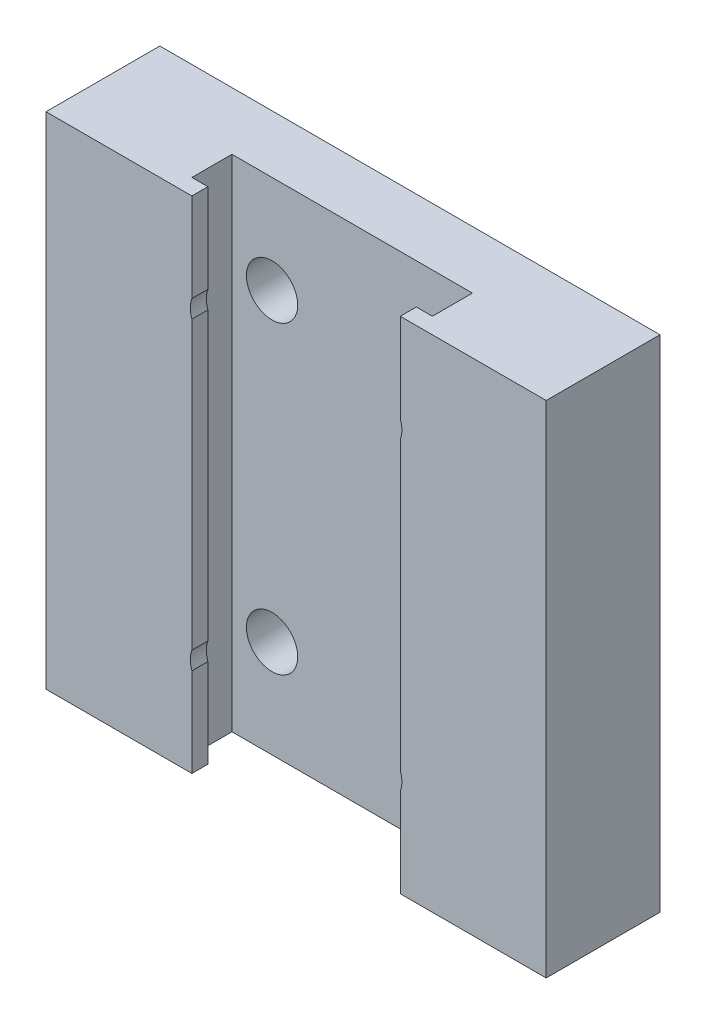
ISO-10303-21;
HEADER;
FILE_DESCRIPTION(('STEP AP214'),'2;1');
FILE_NAME('part.step','',(''),(''),'','','');
FILE_SCHEMA(('AUTOMOTIVE_DESIGN { 1 0 10303 214 1 1 1 1 }'));
ENDSEC;
DATA;
#1=APPLICATION_CONTEXT('core data for automotive mechanical design processes');
#2=APPLICATION_PROTOCOL_DEFINITION('international standard','automotive_design',2000,#1);
#3=PRODUCT_CONTEXT('',#1,'mechanical');
#4=PRODUCT('Part','Part','',(#3));
#5=PRODUCT_RELATED_PRODUCT_CATEGORY('part','',(#4));
#6=PRODUCT_DEFINITION_FORMATION('','',#4);
#7=PRODUCT_DEFINITION_CONTEXT('part definition',#1,'design');
#8=PRODUCT_DEFINITION('design','',#6,#7);
#9=PRODUCT_DEFINITION_SHAPE('','',#8);
#10=(LENGTH_UNIT() NAMED_UNIT(*) SI_UNIT(.MILLI.,.METRE.));
#11=(NAMED_UNIT(*) PLANE_ANGLE_UNIT() SI_UNIT($,.RADIAN.));
#12=(NAMED_UNIT(*) SI_UNIT($,.STERADIAN.) SOLID_ANGLE_UNIT());
#13=UNCERTAINTY_MEASURE_WITH_UNIT(LENGTH_MEASURE(1.E-05),#10,'distance_accuracy_value','');
#14=(GEOMETRIC_REPRESENTATION_CONTEXT(3) GLOBAL_UNCERTAINTY_ASSIGNED_CONTEXT((#13)) GLOBAL_UNIT_ASSIGNED_CONTEXT((#10,
#11,#12)) REPRESENTATION_CONTEXT('',''));
#15=CARTESIAN_POINT('',(0.,0.,0.));
#16=DIRECTION('',(0.,0.,1.));
#17=DIRECTION('',(1.,0.,0.));
#18=AXIS2_PLACEMENT_3D('',#15,#16,#17);
#19=CARTESIAN_POINT('',(6.5,31.2,0.275116875338784));
#20=DIRECTION('',(1.,0.,0.));
#21=DIRECTION('',(0.,0.,-1.));
#22=AXIS2_PLACEMENT_3D('',#19,#20,#21);
#23=PLANE('',#22);
#24=DIRECTION('',(0.,-1.,0.));
#25=VECTOR('',#24,1.);
#26=CARTESIAN_POINT('',(6.5,31.2,1.27511687533878));
#27=LINE('',#26,#25);
#28=CARTESIAN_POINT('',(6.5,5.543223563717,1.27511687533878));
#29=VERTEX_POINT('',#28);
#30=CARTESIAN_POINT('',(6.5,0.,1.27511687533878));
#31=VERTEX_POINT('',#30);
#32=EDGE_CURVE('E360',#29,#31,#27,.T.);
#33=ORIENTED_EDGE('',*,*,#32,.F.);
#34=DIRECTION('',(0.,0.,-1.));
#35=VECTOR('',#34,1.);
#36=CARTESIAN_POINT('',(6.5,5.543223563717,4.17511687533879));
#37=LINE('',#36,#35);
#38=CARTESIAN_POINT('',(6.5,5.543223563717,0.275116875338784));
#39=VERTEX_POINT('',#38);
#40=EDGE_CURVE('E50',#29,#39,#37,.T.);
#41=ORIENTED_EDGE('',*,*,#40,.T.);
#42=DIRECTION('',(0.,-1.,0.));
#43=VECTOR('',#42,1.);
#44=CARTESIAN_POINT('',(6.5,31.2,0.275116875338784));
#45=LINE('',#44,#43);
#46=CARTESIAN_POINT('',(6.5,0.,0.275116875338784));
#47=VERTEX_POINT('',#46);
#48=EDGE_CURVE('E364',#39,#47,#45,.T.);
#49=ORIENTED_EDGE('',*,*,#48,.T.);
#50=DIRECTION('',(0.,0.,1.));
#51=VECTOR('',#50,1.);
#52=CARTESIAN_POINT('',(6.5,0.,0.275116875338784));
#53=LINE('',#52,#51);
#54=EDGE_CURVE('E230',#47,#31,#53,.T.);
#55=ORIENTED_EDGE('',*,*,#54,.T.);
#56=EDGE_LOOP('',(#33,#41,#49,#55));
#57=FACE_BOUND('',#56,.T.);
#58=ADVANCED_FACE('F35',(#57),#23,.F.);
#59=CARTESIAN_POINT('',(6.5,24.543223563717,0.275116875338784));
#60=VERTEX_POINT('',#59);
#61=CARTESIAN_POINT('',(6.5,6.656776436283,0.275116875338784));
#62=VERTEX_POINT('',#61);
#63=EDGE_CURVE('E370',#60,#62,#45,.T.);
#64=ORIENTED_EDGE('',*,*,#63,.T.);
#65=DIRECTION('',(0.,0.,-1.));
#66=VECTOR('',#65,1.);
#67=CARTESIAN_POINT('',(6.5,6.656776436283,4.17511687533879));
#68=LINE('',#67,#66);
#69=CARTESIAN_POINT('',(6.5,6.656776436283,1.27511687533878));
#70=VERTEX_POINT('',#69);
#71=EDGE_CURVE('E270',#62,#70,#68,.F.);
#72=ORIENTED_EDGE('',*,*,#71,.T.);
#73=CARTESIAN_POINT('',(6.5,24.543223563717,1.27511687533878));
#74=VERTEX_POINT('',#73);
#75=EDGE_CURVE('E365',#74,#70,#27,.T.);
#76=ORIENTED_EDGE('',*,*,#75,.F.);
#77=DIRECTION('',(0.,0.,-1.));
#78=VECTOR('',#77,1.);
#79=CARTESIAN_POINT('',(6.5,24.543223563717,4.17511687533879));
#80=LINE('',#79,#78);
#81=EDGE_CURVE('E58',#74,#60,#80,.T.);
#82=ORIENTED_EDGE('',*,*,#81,.T.);
#83=EDGE_LOOP('',(#64,#72,#76,#82));
#84=FACE_BOUND('',#83,.T.);
#85=ADVANCED_FACE('F422',(#84),#23,.F.);
#86=CARTESIAN_POINT('',(-6.5,31.2,0.275116875338785));
#87=DIRECTION('',(-1.,0.,0.));
#88=DIRECTION('',(0.,0.,1.));
#89=AXIS2_PLACEMENT_3D('',#86,#87,#88);
#90=PLANE('',#89);
#91=DIRECTION('',(0.,-1.,0.));
#92=VECTOR('',#91,1.);
#93=CARTESIAN_POINT('',(-6.5,31.2,1.27511687533879));
#94=LINE('',#93,#92);
#95=CARTESIAN_POINT('',(-6.5,24.543223563717,1.27511687533879));
#96=VERTEX_POINT('',#95);
#97=CARTESIAN_POINT('',(-6.5,6.65677643628301,1.27511687533879));
#98=VERTEX_POINT('',#97);
#99=EDGE_CURVE('E200',#96,#98,#94,.T.);
#100=ORIENTED_EDGE('',*,*,#99,.T.);
#101=DIRECTION('',(0.,0.,-1.));
#102=VECTOR('',#101,1.);
#103=CARTESIAN_POINT('',(-6.5,6.65677643628301,4.17511687533879));
#104=LINE('',#103,#102);
#105=CARTESIAN_POINT('',(-6.5,6.65677643628301,0.275116875338785));
#106=VERTEX_POINT('',#105);
#107=EDGE_CURVE('E293',#98,#106,#104,.T.);
#108=ORIENTED_EDGE('',*,*,#107,.T.);
#109=DIRECTION('',(0.,-1.,0.));
#110=VECTOR('',#109,1.);
#111=CARTESIAN_POINT('',(-6.5,31.2,0.275116875338785));
#112=LINE('',#111,#110);
#113=CARTESIAN_POINT('',(-6.5,24.543223563717,0.275116875338785));
#114=VERTEX_POINT('',#113);
#115=EDGE_CURVE('E197',#114,#106,#112,.T.);
#116=ORIENTED_EDGE('',*,*,#115,.F.);
#117=DIRECTION('',(0.,0.,-1.));
#118=VECTOR('',#117,1.);
#119=CARTESIAN_POINT('',(-6.5,24.543223563717,4.17511687533879));
#120=LINE('',#119,#118);
#121=EDGE_CURVE('E176',#114,#96,#120,.F.);
#122=ORIENTED_EDGE('',*,*,#121,.T.);
#123=EDGE_LOOP('',(#100,#108,#116,#122));
#124=FACE_BOUND('',#123,.T.);
#125=ADVANCED_FACE('F400',(#124),#90,.F.);
#126=CARTESIAN_POINT('',(-6.5,31.2,1.27511687533879));
#127=VERTEX_POINT('',#126);
#128=CARTESIAN_POINT('',(-6.5,25.656776436283,1.27511687533879));
#129=VERTEX_POINT('',#128);
#130=EDGE_CURVE('E190',#127,#129,#94,.T.);
#131=ORIENTED_EDGE('',*,*,#130,.T.);
#132=DIRECTION('',(0.,0.,-1.));
#133=VECTOR('',#132,1.);
#134=CARTESIAN_POINT('',(-6.5,25.656776436283,4.17511687533879));
#135=LINE('',#134,#133);
#136=CARTESIAN_POINT('',(-6.5,25.656776436283,0.275116875338785));
#137=VERTEX_POINT('',#136);
#138=EDGE_CURVE('E173',#129,#137,#135,.T.);
#139=ORIENTED_EDGE('',*,*,#138,.T.);
#140=CARTESIAN_POINT('',(-6.5,31.2,0.275116875338785));
#141=VERTEX_POINT('',#140);
#142=EDGE_CURVE('E187',#141,#137,#112,.T.);
#143=ORIENTED_EDGE('',*,*,#142,.F.);
#144=DIRECTION('',(0.,0.,-1.));
#145=VECTOR('',#144,1.);
#146=CARTESIAN_POINT('',(-6.5,31.2,0.275116875338785));
#147=LINE('',#146,#145);
#148=EDGE_CURVE('E211',#127,#141,#147,.T.);
#149=ORIENTED_EDGE('',*,*,#148,.F.);
#150=EDGE_LOOP('',(#131,#139,#143,#149));
#151=FACE_BOUND('',#150,.T.);
#152=ADVANCED_FACE('F185',(#151),#90,.F.);
#153=CARTESIAN_POINT('',(-7.5,31.2,-2.22488312466121));
#154=DIRECTION('',(-1.,0.,0.));
#155=DIRECTION('',(0.,0.,1.));
#156=AXIS2_PLACEMENT_3D('',#153,#154,#155);
#157=PLANE('',#156);
#158=DIRECTION('',(0.,0.,-1.));
#159=VECTOR('',#158,1.);
#160=CARTESIAN_POINT('',(-7.5,0.,-2.22488312466121));
#161=LINE('',#160,#159);
#162=CARTESIAN_POINT('',(-7.5,0.,0.275116875338785));
#163=VERTEX_POINT('',#162);
#164=CARTESIAN_POINT('',(-7.5,0.,-2.22488312466121));
#165=VERTEX_POINT('',#164);
#166=EDGE_CURVE('E240',#163,#165,#161,.T.);
#167=ORIENTED_EDGE('',*,*,#166,.T.);
#168=DIRECTION('',(0.,-1.,0.));
#169=VECTOR('',#168,1.);
#170=CARTESIAN_POINT('',(-7.5,31.2,-2.22488312466121));
#171=LINE('',#170,#169);
#172=CARTESIAN_POINT('',(-7.5,31.2,-2.22488312466121));
#173=VERTEX_POINT('',#172);
#174=EDGE_CURVE('E181',#173,#165,#171,.T.);
#175=ORIENTED_EDGE('',*,*,#174,.F.);
#176=DIRECTION('',(0.,0.,-1.));
#177=VECTOR('',#176,1.);
#178=CARTESIAN_POINT('',(-7.5,31.2,-2.22488312466121));
#179=LINE('',#178,#177);
#180=CARTESIAN_POINT('',(-7.5,31.2,0.275116875338785));
#181=VERTEX_POINT('',#180);
#182=EDGE_CURVE('E216',#181,#173,#179,.T.);
#183=ORIENTED_EDGE('',*,*,#182,.F.);
#184=DIRECTION('',(0.,-1.,0.));
#185=VECTOR('',#184,1.);
#186=CARTESIAN_POINT('',(-7.5,31.2,0.275116875338785));
#187=LINE('',#186,#185);
#188=EDGE_CURVE('E203',#181,#163,#187,.T.);
#189=ORIENTED_EDGE('',*,*,#188,.T.);
#190=EDGE_LOOP('',(#167,#175,#183,#189));
#191=FACE_BOUND('',#190,.T.);
#192=ADVANCED_FACE('F37',(#191),#157,.F.);
#193=CARTESIAN_POINT('',(7.5,31.2,-2.22488312466122));
#194=DIRECTION('',(0.,0.,-1.));
#195=DIRECTION('',(-1.,0.,0.));
#196=AXIS2_PLACEMENT_3D('',#193,#194,#195);
#197=PLANE('',#196);
#198=CARTESIAN_POINT('',(5.,6.1,-2.22488312466122));
#199=DIRECTION('',(0.,0.,-1.));
#200=DIRECTION('',(-1.,0.,0.));
#201=AXIS2_PLACEMENT_3D('',#198,#199,#200);
#202=CIRCLE('',#201,1.6);
#203=CARTESIAN_POINT('',(3.4,6.1,-2.22488312466122));
#204=VERTEX_POINT('',#203);
#205=EDGE_CURVE('E241',#204,#204,#202,.T.);
#206=ORIENTED_EDGE('',*,*,#205,.T.);
#207=EDGE_LOOP('',(#206));
#208=FACE_BOUND('',#207,.T.);
#209=CARTESIAN_POINT('',(-5.,6.1,-2.22488312466121));
#210=DIRECTION('',(0.,0.,-1.));
#211=DIRECTION('',(-1.,0.,0.));
#212=AXIS2_PLACEMENT_3D('',#209,#210,#211);
#213=CIRCLE('',#212,1.6);
#214=CARTESIAN_POINT('',(-6.6,6.1,-2.22488312466121));
#215=VERTEX_POINT('',#214);
#216=EDGE_CURVE('E287',#215,#215,#213,.T.);
#217=ORIENTED_EDGE('',*,*,#216,.T.);
#218=EDGE_LOOP('',(#217));
#219=FACE_BOUND('',#218,.T.);
#220=CARTESIAN_POINT('',(-5.,25.1,-2.22488312466121));
#221=DIRECTION('',(0.,0.,-1.));
#222=DIRECTION('',(-1.,0.,0.));
#223=AXIS2_PLACEMENT_3D('',#220,#221,#222);
#224=CIRCLE('',#223,1.6);
#225=CARTESIAN_POINT('',(-6.6,25.1,-2.22488312466121));
#226=VERTEX_POINT('',#225);
#227=EDGE_CURVE('E299',#226,#226,#224,.T.);
#228=ORIENTED_EDGE('',*,*,#227,.T.);
#229=EDGE_LOOP('',(#228));
#230=FACE_BOUND('',#229,.T.);
#231=CARTESIAN_POINT('',(5.,25.1,-2.22488312466122));
#232=DIRECTION('',(0.,0.,-1.));
#233=DIRECTION('',(-1.,0.,0.));
#234=AXIS2_PLACEMENT_3D('',#231,#232,#233);
#235=CIRCLE('',#234,1.6);
#236=CARTESIAN_POINT('',(3.4,25.1,-2.22488312466122));
#237=VERTEX_POINT('',#236);
#238=EDGE_CURVE('E275',#237,#237,#235,.T.);
#239=ORIENTED_EDGE('',*,*,#238,.T.);
#240=EDGE_LOOP('',(#239));
#241=FACE_BOUND('',#240,.T.);
#242=DIRECTION('',(1.,0.,0.));
#243=VECTOR('',#242,1.);
#244=CARTESIAN_POINT('',(7.5,0.,-2.22488312466122));
#245=LINE('',#244,#243);
#246=CARTESIAN_POINT('',(7.5,0.,-2.22488312466122));
#247=VERTEX_POINT('',#246);
#248=EDGE_CURVE('E238',#165,#247,#245,.T.);
#249=ORIENTED_EDGE('',*,*,#248,.T.);
#250=DIRECTION('',(0.,-1.,0.));
#251=VECTOR('',#250,1.);
#252=CARTESIAN_POINT('',(7.5,31.2,-2.22488312466122));
#253=LINE('',#252,#251);
#254=CARTESIAN_POINT('',(7.5,31.2,-2.22488312466122));
#255=VERTEX_POINT('',#254);
#256=EDGE_CURVE('E373',#255,#247,#253,.T.);
#257=ORIENTED_EDGE('',*,*,#256,.F.);
#258=DIRECTION('',(1.,0.,0.));
#259=VECTOR('',#258,1.);
#260=CARTESIAN_POINT('',(7.5,31.2,-2.22488312466122));
#261=LINE('',#260,#259);
#262=EDGE_CURVE('E260',#173,#255,#261,.T.);
#263=ORIENTED_EDGE('',*,*,#262,.F.);
#264=ORIENTED_EDGE('',*,*,#174,.T.);
#265=EDGE_LOOP('',(#249,#257,#263,#264));
#266=FACE_BOUND('',#265,.T.);
#267=ADVANCED_FACE('F379',(#208,#219,#230,#241,#266),#197,.F.);
#268=CARTESIAN_POINT('',(7.5,31.2,-2.22488312466122));
#269=DIRECTION('',(1.,0.,0.));
#270=DIRECTION('',(0.,0.,-1.));
#271=AXIS2_PLACEMENT_3D('',#268,#269,#270);
#272=PLANE('',#271);
#273=DIRECTION('',(0.,0.,1.));
#274=VECTOR('',#273,1.);
#275=CARTESIAN_POINT('',(7.5,0.,-2.22488312466122));
#276=LINE('',#275,#274);
#277=CARTESIAN_POINT('',(7.5,0.,0.275116875338783));
#278=VERTEX_POINT('',#277);
#279=EDGE_CURVE('E236',#247,#278,#276,.T.);
#280=ORIENTED_EDGE('',*,*,#279,.T.);
#281=DIRECTION('',(0.,-1.,0.));
#282=VECTOR('',#281,1.);
#283=CARTESIAN_POINT('',(7.5,31.2,0.275116875338783));
#284=LINE('',#283,#282);
#285=CARTESIAN_POINT('',(7.5,31.2,0.275116875338783));
#286=VERTEX_POINT('',#285);
#287=EDGE_CURVE('E369',#286,#278,#284,.T.);
#288=ORIENTED_EDGE('',*,*,#287,.F.);
#289=DIRECTION('',(0.,0.,1.));
#290=VECTOR('',#289,1.);
#291=CARTESIAN_POINT('',(7.5,31.2,-2.22488312466122));
#292=LINE('',#291,#290);
#293=EDGE_CURVE('E258',#255,#286,#292,.T.);
#294=ORIENTED_EDGE('',*,*,#293,.F.);
#295=ORIENTED_EDGE('',*,*,#256,.T.);
#296=EDGE_LOOP('',(#280,#288,#294,#295));
#297=FACE_BOUND('',#296,.T.);
#298=ADVANCED_FACE('F386',(#297),#272,.F.);
#299=CARTESIAN_POINT('',(7.5,31.2,0.275116875338783));
#300=DIRECTION('',(0.,0.,1.));
#301=DIRECTION('',(1.,0.,0.));
#302=AXIS2_PLACEMENT_3D('',#299,#300,#301);
#303=PLANE('',#302);
#304=ORIENTED_EDGE('',*,*,#48,.F.);
#305=CARTESIAN_POINT('',(5.,6.1,0.275116875338784));
#306=DIRECTION('',(0.,0.,1.));
#307=DIRECTION('',(1.,0.,0.));
#308=AXIS2_PLACEMENT_3D('',#305,#306,#307);
#309=CIRCLE('',#308,1.6);
#310=EDGE_CURVE('E266',#39,#62,#309,.T.);
#311=ORIENTED_EDGE('',*,*,#310,.T.);
#312=ORIENTED_EDGE('',*,*,#63,.F.);
#313=CARTESIAN_POINT('',(5.,25.1,0.275116875338784));
#314=DIRECTION('',(0.,0.,1.));
#315=DIRECTION('',(1.,0.,0.));
#316=AXIS2_PLACEMENT_3D('',#313,#314,#315);
#317=CIRCLE('',#316,1.6);
#318=CARTESIAN_POINT('',(6.5,25.656776436283,0.275116875338784));
#319=VERTEX_POINT('',#318);
#320=EDGE_CURVE('E278',#60,#319,#317,.T.);
#321=ORIENTED_EDGE('',*,*,#320,.T.);
#322=CARTESIAN_POINT('',(6.5,31.2,0.275116875338784));
#323=VERTEX_POINT('',#322);
#324=EDGE_CURVE('E366',#323,#319,#45,.T.);
#325=ORIENTED_EDGE('',*,*,#324,.F.);
#326=DIRECTION('',(-1.,0.,0.));
#327=VECTOR('',#326,1.);
#328=CARTESIAN_POINT('',(7.5,31.2,0.275116875338783));
#329=LINE('',#328,#327);
#330=EDGE_CURVE('E256',#286,#323,#329,.T.);
#331=ORIENTED_EDGE('',*,*,#330,.F.);
#332=ORIENTED_EDGE('',*,*,#287,.T.);
#333=DIRECTION('',(-1.,0.,0.));
#334=VECTOR('',#333,1.);
#335=CARTESIAN_POINT('',(7.5,0.,0.275116875338783));
#336=LINE('',#335,#334);
#337=EDGE_CURVE('E233',#278,#47,#336,.T.);
#338=ORIENTED_EDGE('',*,*,#337,.T.);
#339=EDGE_LOOP('',(#304,#311,#312,#321,#325,#331,#332,#338));
#340=FACE_BOUND('',#339,.T.);
#341=ADVANCED_FACE('F391',(#340),#303,.F.);
#342=ORIENTED_EDGE('',*,*,#324,.T.);
#343=DIRECTION('',(0.,0.,-1.));
#344=VECTOR('',#343,1.);
#345=CARTESIAN_POINT('',(6.5,25.656776436283,4.17511687533879));
#346=LINE('',#345,#344);
#347=CARTESIAN_POINT('',(6.5,25.656776436283,1.27511687533878));
#348=VERTEX_POINT('',#347);
#349=EDGE_CURVE('E282',#319,#348,#346,.F.);
#350=ORIENTED_EDGE('',*,*,#349,.T.);
#351=CARTESIAN_POINT('',(6.5,31.2,1.27511687533878));
#352=VERTEX_POINT('',#351);
#353=EDGE_CURVE('E361',#352,#348,#27,.T.);
#354=ORIENTED_EDGE('',*,*,#353,.F.);
#355=DIRECTION('',(0.,0.,1.));
#356=VECTOR('',#355,1.);
#357=CARTESIAN_POINT('',(6.5,31.2,0.275116875338784));
#358=LINE('',#357,#356);
#359=EDGE_CURVE('E254',#323,#352,#358,.T.);
#360=ORIENTED_EDGE('',*,*,#359,.F.);
#361=EDGE_LOOP('',(#342,#350,#354,#360));
#362=FACE_BOUND('',#361,.T.);
#363=ADVANCED_FACE('F425',(#362),#23,.F.);
#364=CARTESIAN_POINT('',(6.5,31.2,1.27511687533878));
#365=DIRECTION('',(0.,0.,-1.));
#366=DIRECTION('',(-1.,0.,0.));
#367=AXIS2_PLACEMENT_3D('',#364,#365,#366);
#368=PLANE('',#367);
#369=ORIENTED_EDGE('',*,*,#75,.T.);
#370=CARTESIAN_POINT('',(5.,6.1,1.27511687533878));
#371=DIRECTION('',(0.,0.,-1.));
#372=DIRECTION('',(-1.,0.,0.));
#373=AXIS2_PLACEMENT_3D('',#370,#371,#372);
#374=CIRCLE('',#373,1.6);
#375=EDGE_CURVE('E273',#70,#29,#374,.T.);
#376=ORIENTED_EDGE('',*,*,#375,.T.);
#377=ORIENTED_EDGE('',*,*,#32,.T.);
#378=DIRECTION('',(1.,0.,0.));
#379=VECTOR('',#378,1.);
#380=CARTESIAN_POINT('',(6.5,0.,1.27511687533878));
#381=LINE('',#380,#379);
#382=CARTESIAN_POINT('',(15.6,0.,1.27511687533879));
#383=VERTEX_POINT('',#382);
#384=EDGE_CURVE('E228',#31,#383,#381,.T.);
#385=ORIENTED_EDGE('',*,*,#384,.T.);
#386=DIRECTION('',(0.,-1.,0.));
#387=VECTOR('',#386,1.);
#388=CARTESIAN_POINT('',(15.6,31.2,1.27511687533879));
#389=LINE('',#388,#387);
#390=CARTESIAN_POINT('',(15.6,31.2,1.27511687533879));
#391=VERTEX_POINT('',#390);
#392=EDGE_CURVE('E357',#391,#383,#389,.T.);
#393=ORIENTED_EDGE('',*,*,#392,.F.);
#394=DIRECTION('',(1.,0.,0.));
#395=VECTOR('',#394,1.);
#396=CARTESIAN_POINT('',(6.5,31.2,1.27511687533878));
#397=LINE('',#396,#395);
#398=EDGE_CURVE('E252',#352,#391,#397,.T.);
#399=ORIENTED_EDGE('',*,*,#398,.F.);
#400=ORIENTED_EDGE('',*,*,#353,.T.);
#401=CARTESIAN_POINT('',(5.,25.1,1.27511687533878));
#402=DIRECTION('',(0.,0.,-1.));
#403=DIRECTION('',(-1.,0.,0.));
#404=AXIS2_PLACEMENT_3D('',#401,#402,#403);
#405=CIRCLE('',#404,1.6);
#406=EDGE_CURVE('E285',#348,#74,#405,.T.);
#407=ORIENTED_EDGE('',*,*,#406,.T.);
#408=EDGE_LOOP('',(#369,#376,#377,#385,#393,#399,#400,#407));
#409=FACE_BOUND('',#408,.T.);
#410=ADVANCED_FACE('F435',(#409),#368,.F.);
#411=CARTESIAN_POINT('',(15.6,31.2,1.27511687533879));
#412=DIRECTION('',(-1.,0.,0.));
#413=DIRECTION('',(0.,0.,1.));
#414=AXIS2_PLACEMENT_3D('',#411,#412,#413);
#415=PLANE('',#414);
#416=DIRECTION('',(0.,0.,-1.));
#417=VECTOR('',#416,1.);
#418=CARTESIAN_POINT('',(15.6,0.,1.27511687533879));
#419=LINE('',#418,#417);
#420=CARTESIAN_POINT('',(15.6,0.,-5.82488312466121));
#421=VERTEX_POINT('',#420);
#422=EDGE_CURVE('E226',#383,#421,#419,.T.);
#423=ORIENTED_EDGE('',*,*,#422,.T.);
#424=DIRECTION('',(0.,-1.,0.));
#425=VECTOR('',#424,1.);
#426=CARTESIAN_POINT('',(15.6,31.2,-5.82488312466121));
#427=LINE('',#426,#425);
#428=CARTESIAN_POINT('',(15.6,31.2,-5.82488312466121));
#429=VERTEX_POINT('',#428);
#430=EDGE_CURVE('E337',#429,#421,#427,.T.);
#431=ORIENTED_EDGE('',*,*,#430,.F.);
#432=DIRECTION('',(0.,0.,-1.));
#433=VECTOR('',#432,1.);
#434=CARTESIAN_POINT('',(15.6,31.2,1.27511687533879));
#435=LINE('',#434,#433);
#436=EDGE_CURVE('E250',#391,#429,#435,.T.);
#437=ORIENTED_EDGE('',*,*,#436,.F.);
#438=ORIENTED_EDGE('',*,*,#392,.T.);
#439=EDGE_LOOP('',(#423,#431,#437,#438));
#440=FACE_BOUND('',#439,.T.);
#441=ADVANCED_FACE('F324',(#440),#415,.F.);
#442=CARTESIAN_POINT('',(-15.6,31.2,-5.82488312466121));
#443=DIRECTION('',(0.,0.,1.));
#444=DIRECTION('',(1.,0.,0.));
#445=AXIS2_PLACEMENT_3D('',#442,#443,#444);
#446=PLANE('',#445);
#447=CARTESIAN_POINT('',(5.,6.1,-5.82488312466121));
#448=DIRECTION('',(0.,0.,-1.));
#449=DIRECTION('',(1.,0.,0.));
#450=AXIS2_PLACEMENT_3D('',#447,#448,#449);
#451=CIRCLE('',#450,1.6);
#452=CARTESIAN_POINT('',(6.6,6.1,-5.82488312466121));
#453=VERTEX_POINT('',#452);
#454=EDGE_CURVE('E308',#453,#453,#451,.T.);
#455=ORIENTED_EDGE('',*,*,#454,.F.);
#456=EDGE_LOOP('',(#455));
#457=FACE_BOUND('',#456,.T.);
#458=CARTESIAN_POINT('',(-5.,6.1,-5.82488312466121));
#459=DIRECTION('',(0.,0.,-1.));
#460=DIRECTION('',(-1.,0.,0.));
#461=AXIS2_PLACEMENT_3D('',#458,#459,#460);
#462=CIRCLE('',#461,1.6);
#463=CARTESIAN_POINT('',(-6.6,6.1,-5.82488312466121));
#464=VERTEX_POINT('',#463);
#465=EDGE_CURVE('E311',#464,#464,#462,.T.);
#466=ORIENTED_EDGE('',*,*,#465,.F.);
#467=EDGE_LOOP('',(#466));
#468=FACE_BOUND('',#467,.T.);
#469=CARTESIAN_POINT('',(-5.,25.1,-5.82488312466121));
#470=DIRECTION('',(0.,0.,-1.));
#471=DIRECTION('',(1.,0.,0.));
#472=AXIS2_PLACEMENT_3D('',#469,#470,#471);
#473=CIRCLE('',#472,1.6);
#474=CARTESIAN_POINT('',(-3.4,25.1,-5.82488312466121));
#475=VERTEX_POINT('',#474);
#476=EDGE_CURVE('E307',#475,#475,#473,.T.);
#477=ORIENTED_EDGE('',*,*,#476,.F.);
#478=EDGE_LOOP('',(#477));
#479=FACE_BOUND('',#478,.T.);
#480=CARTESIAN_POINT('',(5.,25.1,-5.82488312466121));
#481=DIRECTION('',(0.,0.,-1.));
#482=DIRECTION('',(-1.,0.,0.));
#483=AXIS2_PLACEMENT_3D('',#480,#481,#482);
#484=CIRCLE('',#483,1.6);
#485=CARTESIAN_POINT('',(3.4,25.1,-5.82488312466121));
#486=VERTEX_POINT('',#485);
#487=EDGE_CURVE('E304',#486,#486,#484,.T.);
#488=ORIENTED_EDGE('',*,*,#487,.F.);
#489=EDGE_LOOP('',(#488));
#490=FACE_BOUND('',#489,.T.);
#491=DIRECTION('',(-1.,0.,0.));
#492=VECTOR('',#491,1.);
#493=CARTESIAN_POINT('',(-15.6,0.,-5.82488312466121));
#494=LINE('',#493,#492);
#495=CARTESIAN_POINT('',(-15.6,0.,-5.82488312466121));
#496=VERTEX_POINT('',#495);
#497=EDGE_CURVE('E224',#421,#496,#494,.T.);
#498=ORIENTED_EDGE('',*,*,#497,.T.);
#499=DIRECTION('',(0.,-1.,0.));
#500=VECTOR('',#499,1.);
#501=CARTESIAN_POINT('',(-15.6,31.2,-5.82488312466121));
#502=LINE('',#501,#500);
#503=CARTESIAN_POINT('',(-15.6,31.2,-5.82488312466121));
#504=VERTEX_POINT('',#503);
#505=EDGE_CURVE('E334',#504,#496,#502,.T.);
#506=ORIENTED_EDGE('',*,*,#505,.F.);
#507=DIRECTION('',(-1.,0.,0.));
#508=VECTOR('',#507,1.);
#509=CARTESIAN_POINT('',(-15.6,31.2,-5.82488312466121));
#510=LINE('',#509,#508);
#511=EDGE_CURVE('E248',#429,#504,#510,.T.);
#512=ORIENTED_EDGE('',*,*,#511,.F.);
#513=ORIENTED_EDGE('',*,*,#430,.T.);
#514=EDGE_LOOP('',(#498,#506,#512,#513));
#515=FACE_BOUND('',#514,.T.);
#516=ADVANCED_FACE('F320',(#457,#468,#479,#490,#515),#446,.F.);
#517=CARTESIAN_POINT('',(-15.6,31.2,1.27511687533879));
#518=DIRECTION('',(1.,0.,0.));
#519=DIRECTION('',(0.,0.,-1.));
#520=AXIS2_PLACEMENT_3D('',#517,#518,#519);
#521=PLANE('',#520);
#522=DIRECTION('',(0.,0.,1.));
#523=VECTOR('',#522,1.);
#524=CARTESIAN_POINT('',(-15.6,0.,1.27511687533879));
#525=LINE('',#524,#523);
#526=CARTESIAN_POINT('',(-15.6,0.,1.27511687533879));
#527=VERTEX_POINT('',#526);
#528=EDGE_CURVE('E222',#496,#527,#525,.T.);
#529=ORIENTED_EDGE('',*,*,#528,.T.);
#530=DIRECTION('',(0.,-1.,0.));
#531=VECTOR('',#530,1.);
#532=CARTESIAN_POINT('',(-15.6,31.2,1.27511687533879));
#533=LINE('',#532,#531);
#534=CARTESIAN_POINT('',(-15.6,31.2,1.27511687533879));
#535=VERTEX_POINT('',#534);
#536=EDGE_CURVE('E344',#535,#527,#533,.T.);
#537=ORIENTED_EDGE('',*,*,#536,.F.);
#538=DIRECTION('',(0.,0.,1.));
#539=VECTOR('',#538,1.);
#540=CARTESIAN_POINT('',(-15.6,31.2,1.27511687533879));
#541=LINE('',#540,#539);
#542=EDGE_CURVE('E246',#504,#535,#541,.T.);
#543=ORIENTED_EDGE('',*,*,#542,.F.);
#544=ORIENTED_EDGE('',*,*,#505,.T.);
#545=EDGE_LOOP('',(#529,#537,#543,#544));
#546=FACE_BOUND('',#545,.T.);
#547=ADVANCED_FACE('F323',(#546),#521,.F.);
#548=CARTESIAN_POINT('',(-6.5,31.2,1.27511687533879));
#549=DIRECTION('',(0.,0.,-1.));
#550=DIRECTION('',(-1.,0.,0.));
#551=AXIS2_PLACEMENT_3D('',#548,#549,#550);
#552=PLANE('',#551);
#553=CARTESIAN_POINT('',(-6.5,5.54322356371699,1.27511687533879));
#554=VERTEX_POINT('',#553);
#555=CARTESIAN_POINT('',(-6.5,0.,1.27511687533879));
#556=VERTEX_POINT('',#555);
#557=EDGE_CURVE('E196',#554,#556,#94,.T.);
#558=ORIENTED_EDGE('',*,*,#557,.F.);
#559=CARTESIAN_POINT('',(-5.,6.1,1.27511687533879));
#560=DIRECTION('',(0.,0.,-1.));
#561=DIRECTION('',(-1.,0.,0.));
#562=AXIS2_PLACEMENT_3D('',#559,#560,#561);
#563=CIRCLE('',#562,1.6);
#564=EDGE_CURVE('E290',#554,#98,#563,.T.);
#565=ORIENTED_EDGE('',*,*,#564,.T.);
#566=ORIENTED_EDGE('',*,*,#99,.F.);
#567=CARTESIAN_POINT('',(-5.,25.1,1.27511687533879));
#568=DIRECTION('',(0.,0.,-1.));
#569=DIRECTION('',(-1.,0.,0.));
#570=AXIS2_PLACEMENT_3D('',#567,#568,#569);
#571=CIRCLE('',#570,1.6);
#572=EDGE_CURVE('E191',#96,#129,#571,.T.);
#573=ORIENTED_EDGE('',*,*,#572,.T.);
#574=ORIENTED_EDGE('',*,*,#130,.F.);
#575=DIRECTION('',(1.,0.,0.));
#576=VECTOR('',#575,1.);
#577=CARTESIAN_POINT('',(-6.5,31.2,1.27511687533879));
#578=LINE('',#577,#576);
#579=EDGE_CURVE('E244',#535,#127,#578,.T.);
#580=ORIENTED_EDGE('',*,*,#579,.F.);
#581=ORIENTED_EDGE('',*,*,#536,.T.);
#582=DIRECTION('',(1.,0.,0.));
#583=VECTOR('',#582,1.);
#584=CARTESIAN_POINT('',(-6.5,0.,1.27511687533879));
#585=LINE('',#584,#583);
#586=EDGE_CURVE('E219',#527,#556,#585,.T.);
#587=ORIENTED_EDGE('',*,*,#586,.T.);
#588=EDGE_LOOP('',(#558,#565,#566,#573,#574,#580,#581,#587));
#589=FACE_BOUND('',#588,.T.);
#590=ADVANCED_FACE('F352',(#589),#552,.F.);
#591=CARTESIAN_POINT('',(-6.5,5.54322356371699,0.275116875338785));
#592=VERTEX_POINT('',#591);
#593=CARTESIAN_POINT('',(-6.5,0.,0.275116875338785));
#594=VERTEX_POINT('',#593);
#595=EDGE_CURVE('E199',#592,#594,#112,.T.);
#596=ORIENTED_EDGE('',*,*,#595,.F.);
#597=DIRECTION('',(0.,0.,-1.));
#598=VECTOR('',#597,1.);
#599=CARTESIAN_POINT('',(-6.5,5.54322356371699,4.17511687533879));
#600=LINE('',#599,#598);
#601=EDGE_CURVE('E296',#592,#554,#600,.F.);
#602=ORIENTED_EDGE('',*,*,#601,.T.);
#603=ORIENTED_EDGE('',*,*,#557,.T.);
#604=DIRECTION('',(0.,0.,-1.));
#605=VECTOR('',#604,1.);
#606=CARTESIAN_POINT('',(-6.5,0.,0.275116875338785));
#607=LINE('',#606,#605);
#608=EDGE_CURVE('E217',#556,#594,#607,.T.);
#609=ORIENTED_EDGE('',*,*,#608,.T.);
#610=EDGE_LOOP('',(#596,#602,#603,#609));
#611=FACE_BOUND('',#610,.T.);
#612=ADVANCED_FACE('F403',(#611),#90,.F.);
#613=CARTESIAN_POINT('',(-7.5,31.2,0.275116875338785));
#614=DIRECTION('',(0.,0.,1.));
#615=DIRECTION('',(1.,0.,0.));
#616=AXIS2_PLACEMENT_3D('',#613,#614,#615);
#617=PLANE('',#616);
#618=ORIENTED_EDGE('',*,*,#115,.T.);
#619=CARTESIAN_POINT('',(-5.,6.1,0.275116875338785));
#620=DIRECTION('',(0.,0.,1.));
#621=DIRECTION('',(1.,0.,0.));
#622=AXIS2_PLACEMENT_3D('',#619,#620,#621);
#623=CIRCLE('',#622,1.6);
#624=EDGE_CURVE('E11',#106,#592,#623,.T.);
#625=ORIENTED_EDGE('',*,*,#624,.T.);
#626=ORIENTED_EDGE('',*,*,#595,.T.);
#627=DIRECTION('',(-1.,0.,0.));
#628=VECTOR('',#627,1.);
#629=CARTESIAN_POINT('',(-7.5,0.,0.275116875338785));
#630=LINE('',#629,#628);
#631=EDGE_CURVE('E214',#594,#163,#630,.T.);
#632=ORIENTED_EDGE('',*,*,#631,.T.);
#633=ORIENTED_EDGE('',*,*,#188,.F.);
#634=DIRECTION('',(-1.,0.,0.));
#635=VECTOR('',#634,1.);
#636=CARTESIAN_POINT('',(-7.5,31.2,0.275116875338785));
#637=LINE('',#636,#635);
#638=EDGE_CURVE('E195',#141,#181,#637,.T.);
#639=ORIENTED_EDGE('',*,*,#638,.F.);
#640=ORIENTED_EDGE('',*,*,#142,.T.);
#641=CARTESIAN_POINT('',(-5.,25.1,0.275116875338785));
#642=DIRECTION('',(0.,0.,1.));
#643=DIRECTION('',(1.,0.,0.));
#644=AXIS2_PLACEMENT_3D('',#641,#642,#643);
#645=CIRCLE('',#644,1.6);
#646=EDGE_CURVE('E43',#137,#114,#645,.T.);
#647=ORIENTED_EDGE('',*,*,#646,.T.);
#648=EDGE_LOOP('',(#618,#625,#626,#632,#633,#639,#640,#647));
#649=FACE_BOUND('',#648,.T.);
#650=ADVANCED_FACE('F193',(#649),#617,.F.);
#651=CARTESIAN_POINT('',(0.,31.2,0.));
#652=DIRECTION('',(0.,1.,0.));
#653=DIRECTION('',(0.,0.,1.));
#654=AXIS2_PLACEMENT_3D('',#651,#652,#653);
#655=PLANE('',#654);
#656=ORIENTED_EDGE('',*,*,#182,.T.);
#657=ORIENTED_EDGE('',*,*,#262,.T.);
#658=ORIENTED_EDGE('',*,*,#293,.T.);
#659=ORIENTED_EDGE('',*,*,#330,.T.);
#660=ORIENTED_EDGE('',*,*,#359,.T.);
#661=ORIENTED_EDGE('',*,*,#398,.T.);
#662=ORIENTED_EDGE('',*,*,#436,.T.);
#663=ORIENTED_EDGE('',*,*,#511,.T.);
#664=ORIENTED_EDGE('',*,*,#542,.T.);
#665=ORIENTED_EDGE('',*,*,#579,.T.);
#666=ORIENTED_EDGE('',*,*,#148,.T.);
#667=ORIENTED_EDGE('',*,*,#638,.T.);
#668=EDGE_LOOP('',(#656,#657,#658,#659,#660,#661,#662,#663,#664,#665,#666,#667));
#669=FACE_BOUND('',#668,.T.);
#670=ADVANCED_FACE('F395',(#669),#655,.T.);
#671=CARTESIAN_POINT('',(0.,0.,0.));
#672=DIRECTION('',(0.,1.,0.));
#673=DIRECTION('',(0.,0.,1.));
#674=AXIS2_PLACEMENT_3D('',#671,#672,#673);
#675=PLANE('',#674);
#676=ORIENTED_EDGE('',*,*,#166,.F.);
#677=ORIENTED_EDGE('',*,*,#631,.F.);
#678=ORIENTED_EDGE('',*,*,#608,.F.);
#679=ORIENTED_EDGE('',*,*,#586,.F.);
#680=ORIENTED_EDGE('',*,*,#528,.F.);
#681=ORIENTED_EDGE('',*,*,#497,.F.);
#682=ORIENTED_EDGE('',*,*,#422,.F.);
#683=ORIENTED_EDGE('',*,*,#384,.F.);
#684=ORIENTED_EDGE('',*,*,#54,.F.);
#685=ORIENTED_EDGE('',*,*,#337,.F.);
#686=ORIENTED_EDGE('',*,*,#279,.F.);
#687=ORIENTED_EDGE('',*,*,#248,.F.);
#688=EDGE_LOOP('',(#676,#677,#678,#679,#680,#681,#682,#683,#684,#685,#686,#687));
#689=FACE_BOUND('',#688,.T.);
#690=ADVANCED_FACE('F347',(#689),#675,.F.);
#691=CARTESIAN_POINT('',(-5.,25.1,4.17511687533879));
#692=DIRECTION('',(0.,0.,-1.));
#693=DIRECTION('',(-1.,0.,0.));
#694=AXIS2_PLACEMENT_3D('',#691,#692,#693);
#695=CYLINDRICAL_SURFACE('',#694,1.6);
#696=ORIENTED_EDGE('',*,*,#121,.F.);
#697=ORIENTED_EDGE('',*,*,#646,.F.);
#698=ORIENTED_EDGE('',*,*,#138,.F.);
#699=ORIENTED_EDGE('',*,*,#572,.F.);
#700=EDGE_LOOP('',(#696,#697,#698,#699));
#701=FACE_BOUND('',#700,.T.);
#702=ADVANCED_FACE('F172',(#701),#695,.F.);
#703=CARTESIAN_POINT('',(-5.,6.1,4.17511687533879));
#704=DIRECTION('',(0.,0.,-1.));
#705=DIRECTION('',(-1.,0.,0.));
#706=AXIS2_PLACEMENT_3D('',#703,#704,#705);
#707=CYLINDRICAL_SURFACE('',#706,1.6);
#708=ORIENTED_EDGE('',*,*,#601,.F.);
#709=ORIENTED_EDGE('',*,*,#624,.F.);
#710=ORIENTED_EDGE('',*,*,#107,.F.);
#711=ORIENTED_EDGE('',*,*,#564,.F.);
#712=EDGE_LOOP('',(#708,#709,#710,#711));
#713=FACE_BOUND('',#712,.T.);
#714=ADVANCED_FACE('F404',(#713),#707,.F.);
#715=CARTESIAN_POINT('',(5.,25.1,4.17511687533879));
#716=DIRECTION('',(0.,0.,-1.));
#717=DIRECTION('',(-1.,0.,0.));
#718=AXIS2_PLACEMENT_3D('',#715,#716,#717);
#719=CYLINDRICAL_SURFACE('',#718,1.6);
#720=ORIENTED_EDGE('',*,*,#487,.T.);
#721=EDGE_LOOP('',(#720));
#722=FACE_BOUND('',#721,.T.);
#723=ORIENTED_EDGE('',*,*,#238,.F.);
#724=EDGE_LOOP('',(#723));
#725=FACE_BOUND('',#724,.T.);
#726=ADVANCED_FACE('F406',(#722,#725),#719,.F.);
#727=ORIENTED_EDGE('',*,*,#476,.T.);
#728=EDGE_LOOP('',(#727));
#729=FACE_BOUND('',#728,.T.);
#730=ORIENTED_EDGE('',*,*,#227,.F.);
#731=EDGE_LOOP('',(#730));
#732=FACE_BOUND('',#731,.T.);
#733=ADVANCED_FACE('F317',(#729,#732),#695,.F.);
#734=ORIENTED_EDGE('',*,*,#465,.T.);
#735=EDGE_LOOP('',(#734));
#736=FACE_BOUND('',#735,.T.);
#737=ORIENTED_EDGE('',*,*,#216,.F.);
#738=EDGE_LOOP('',(#737));
#739=FACE_BOUND('',#738,.T.);
#740=ADVANCED_FACE('F408',(#736,#739),#707,.F.);
#741=CARTESIAN_POINT('',(5.,6.1,4.17511687533879));
#742=DIRECTION('',(0.,0.,-1.));
#743=DIRECTION('',(-1.,0.,0.));
#744=AXIS2_PLACEMENT_3D('',#741,#742,#743);
#745=CYLINDRICAL_SURFACE('',#744,1.6);
#746=ORIENTED_EDGE('',*,*,#454,.T.);
#747=EDGE_LOOP('',(#746));
#748=FACE_BOUND('',#747,.T.);
#749=ORIENTED_EDGE('',*,*,#205,.F.);
#750=EDGE_LOOP('',(#749));
#751=FACE_BOUND('',#750,.T.);
#752=ADVANCED_FACE('F419',(#748,#751),#745,.F.);
#753=ORIENTED_EDGE('',*,*,#81,.F.);
#754=ORIENTED_EDGE('',*,*,#406,.F.);
#755=ORIENTED_EDGE('',*,*,#349,.F.);
#756=ORIENTED_EDGE('',*,*,#320,.F.);
#757=EDGE_LOOP('',(#753,#754,#755,#756));
#758=FACE_BOUND('',#757,.T.);
#759=ADVANCED_FACE('F415',(#758),#719,.F.);
#760=ORIENTED_EDGE('',*,*,#40,.F.);
#761=ORIENTED_EDGE('',*,*,#375,.F.);
#762=ORIENTED_EDGE('',*,*,#71,.F.);
#763=ORIENTED_EDGE('',*,*,#310,.F.);
#764=EDGE_LOOP('',(#760,#761,#762,#763));
#765=FACE_BOUND('',#764,.T.);
#766=ADVANCED_FACE('F451',(#765),#745,.F.);
#767=CLOSED_SHELL('',(#58,#85,#125,#152,#192,#267,#298,#341,#363,#410,#441,#516,#547,#590,#612,
#650,#670,#690,#702,#714,#726,#733,#740,#752,#759,#766));
#768=MANIFOLD_SOLID_BREP('B2',#767);
#769=ADVANCED_BREP_SHAPE_REPRESENTATION('',(#18,#768),#14);
#770=SHAPE_DEFINITION_REPRESENTATION(#9,#769);
ENDSEC;
END-ISO-10303-21;
